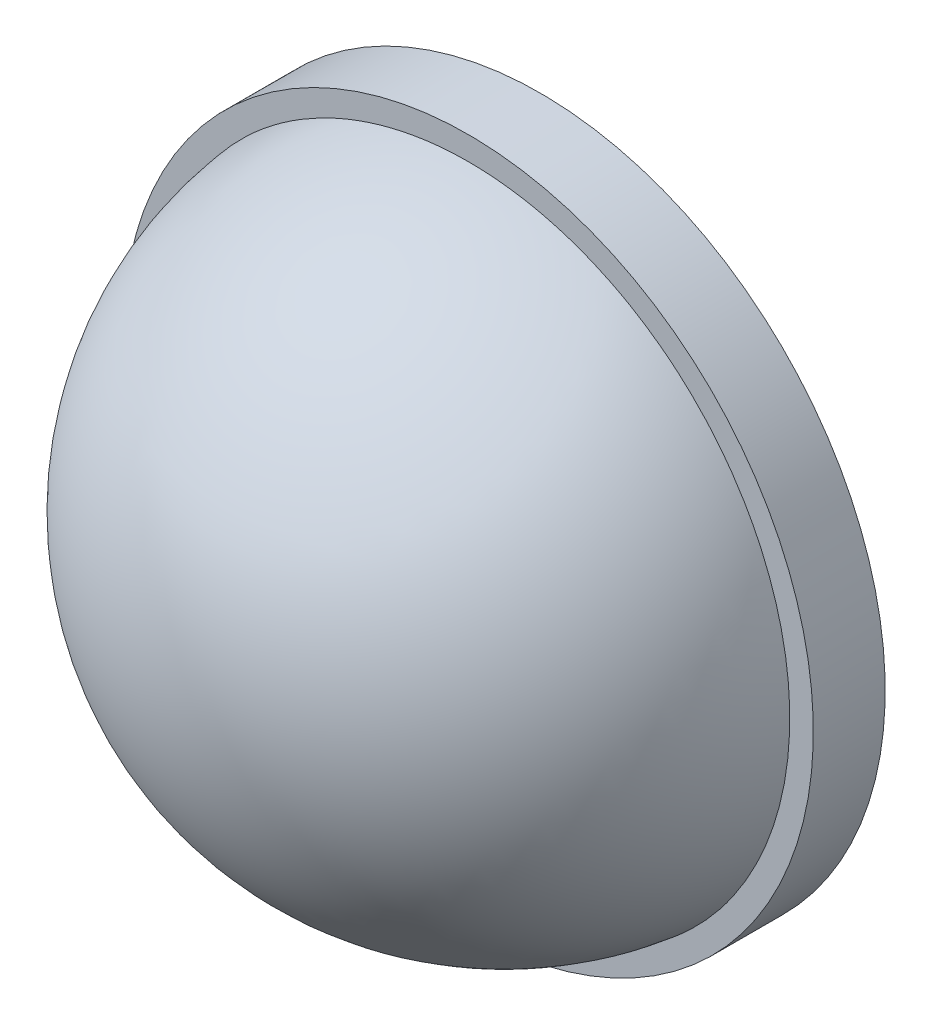
ISO-10303-21;
HEADER;
FILE_DESCRIPTION(('STEP AP214'),'2;1');
FILE_NAME('part.step','',(''),(''),'','','');
FILE_SCHEMA(('AUTOMOTIVE_DESIGN { 1 0 10303 214 1 1 1 1 }'));
ENDSEC;
DATA;
#1=APPLICATION_CONTEXT('core data for automotive mechanical design processes');
#2=APPLICATION_PROTOCOL_DEFINITION('international standard','automotive_design',2000,#1);
#3=PRODUCT_CONTEXT('',#1,'mechanical');
#4=PRODUCT('Part','Part','',(#3));
#5=PRODUCT_RELATED_PRODUCT_CATEGORY('part','',(#4));
#6=PRODUCT_DEFINITION_FORMATION('','',#4);
#7=PRODUCT_DEFINITION_CONTEXT('part definition',#1,'design');
#8=PRODUCT_DEFINITION('design','',#6,#7);
#9=PRODUCT_DEFINITION_SHAPE('','',#8);
#10=(LENGTH_UNIT() NAMED_UNIT(*) SI_UNIT(.MILLI.,.METRE.));
#11=(NAMED_UNIT(*) PLANE_ANGLE_UNIT() SI_UNIT($,.RADIAN.));
#12=(NAMED_UNIT(*) SI_UNIT($,.STERADIAN.) SOLID_ANGLE_UNIT());
#13=UNCERTAINTY_MEASURE_WITH_UNIT(LENGTH_MEASURE(1.E-05),#10,'distance_accuracy_value','');
#14=(GEOMETRIC_REPRESENTATION_CONTEXT(3) GLOBAL_UNCERTAINTY_ASSIGNED_CONTEXT((#13)) GLOBAL_UNIT_ASSIGNED_CONTEXT((#10,
#11,#12)) REPRESENTATION_CONTEXT('',''));
#15=CARTESIAN_POINT('',(0.,0.,0.));
#16=DIRECTION('',(0.,0.,1.));
#17=DIRECTION('',(1.,0.,0.));
#18=AXIS2_PLACEMENT_3D('',#15,#16,#17);
#19=CARTESIAN_POINT('',(0.,0.,0.));
#20=DIRECTION('',(0.,1.,0.));
#21=DIRECTION('',(0.,0.,1.));
#22=AXIS2_PLACEMENT_3D('',#19,#20,#21);
#23=SPHERICAL_SURFACE('',#22,4.5);
#24=CARTESIAN_POINT('',(0.,4.47213595499958,0.5));
#25=CARTESIAN_POINT('',(-0.150997514664612,4.47213887848108,0.5));
#26=CARTESIAN_POINT('',(-0.301969495913377,4.46448489805465,0.5));
#27=CARTESIAN_POINT('',(-0.602482273010113,4.43394007426907,0.5));
#28=CARTESIAN_POINT('',(-0.752022119762018,4.41103975193288,0.500000000000001));
#29=CARTESIAN_POINT('',(-1.02307863973414,4.3553539857282,0.500000000000001));
#30=CARTESIAN_POINT('',(-1.14507673289361,4.32488021057134,0.5));
#31=CARTESIAN_POINT('',(-1.3861170686883,4.25375942153719,0.5));
#32=CARTESIAN_POINT('',(-1.50515844505664,4.21310946397593,0.5));
#33=CARTESIAN_POINT('',(-1.73948709294649,4.12189355647516,0.5));
#34=CARTESIAN_POINT('',(-1.85477128486625,4.07131969942959,0.5));
#35=CARTESIAN_POINT('',(-2.08070940666502,3.96061604037249,0.5));
#36=CARTESIAN_POINT('',(-2.19136162660478,3.90048274802251,0.5));
#37=CARTESIAN_POINT('',(-2.40711503658964,3.77115412998921,0.5));
#38=CARTESIAN_POINT('',(-2.51222064528998,3.70196617534453,0.499999999999999));
#39=CARTESIAN_POINT('',(-2.71626783258023,3.55495522693636,0.500000000000002));
#40=CARTESIAN_POINT('',(-2.81520712411537,3.47712905871716,0.500000000000004));
#41=CARTESIAN_POINT('',(-3.00611704982059,3.31346626629332,0.499999999999997));
#42=CARTESIAN_POINT('',(-3.09809190872835,3.22763457005807,0.499999999999986));
#43=CARTESIAN_POINT('',(-3.27451904332029,3.0484971729806,0.500000000000015));
#44=CARTESIAN_POINT('',(-3.35896853015982,2.95518872544114,0.500000000000053));
#45=CARTESIAN_POINT('',(-3.51968465250268,2.76181489479289,0.500000000000053));
#46=CARTESIAN_POINT('',(-3.59595347767667,2.6617513315299,0.500000000000015));
#47=CARTESIAN_POINT('',(-3.73981886528146,2.45551787522962,0.499999999999986));
#48=CARTESIAN_POINT('',(-3.80741221507932,2.34934574107259,0.499999999999997));
#49=CARTESIAN_POINT('',(-3.93339224115332,2.13171957576029,0.500000000000004));
#50=CARTESIAN_POINT('',(-3.99178192636583,2.02026728639832,0.500000000000002));
#51=CARTESIAN_POINT('',(-4.09898616509148,1.79279863126297,0.499999999999999));
#52=CARTESIAN_POINT('',(-4.14779717531719,1.67678059553606,0.499999999999999));
#53=CARTESIAN_POINT('',(-4.23545292877497,1.44109010330004,0.5));
#54=CARTESIAN_POINT('',(-4.27430153379665,1.32141908301163,0.5));
#55=CARTESIAN_POINT('',(-4.34179371461896,1.0791855642772,0.500000000000001));
#56=CARTESIAN_POINT('',(-4.37043351750144,0.956622014629919,0.5));
#57=CARTESIAN_POINT('',(-4.41727535839403,0.709563064049555,0.5));
#58=CARTESIAN_POINT('',(-4.43548127777803,0.585068399209327,0.500000000000001));
#59=CARTESIAN_POINT('',(-4.4613483228333,0.33494413435646,0.5));
#60=CARTESIAN_POINT('',(-4.46900555289547,0.209314132296478,0.5));
#61=CARTESIAN_POINT('',(-4.47370330378257,-0.0421067366506297,0.5));
#62=CARTESIAN_POINT('',(-4.47074773301795,-0.167897527266527,0.5));
#63=CARTESIAN_POINT('',(-4.45426150332976,-0.418796730104737,0.500000000000001));
#64=CARTESIAN_POINT('',(-4.44072694046182,-0.543904873244764,0.500000000000001));
#65=CARTESIAN_POINT('',(-4.38435427865963,-0.916768604936241,0.5));
#66=CARTESIAN_POINT('',(-4.32575205895234,-1.16233640802484,0.5));
#67=CARTESIAN_POINT('',(-4.16817661474933,-1.64001540578852,0.5));
#68=CARTESIAN_POINT('',(-4.06920289654608,-1.87212643585958,0.5));
#69=CARTESIAN_POINT('',(-3.83368748984246,-2.31646802342858,0.500000000000001));
#70=CARTESIAN_POINT('',(-3.69714677734392,-2.52869909722178,0.5));
#71=CARTESIAN_POINT('',(-3.39038630415402,-2.92720365271011,0.500000000000001));
#72=CARTESIAN_POINT('',(-3.22016866561958,-3.11347876876418,0.500000000000001));
#73=CARTESIAN_POINT('',(-2.85084401981479,-3.45483950694928,0.5));
#74=CARTESIAN_POINT('',(-2.65173262592018,-3.60992038465297,0.499999999999999));
#75=CARTESIAN_POINT('',(-2.2302624176303,-3.88448582361263,0.499999999999999));
#76=CARTESIAN_POINT('',(-2.00789725690763,-4.00396063296944,0.5));
#77=CARTESIAN_POINT('',(-1.54634080827002,-4.20380349017741,0.500000000000001));
#78=CARTESIAN_POINT('',(-1.30716139095409,-4.2841988163888,0.5));
#79=CARTESIAN_POINT('',(-0.889195891287263,-4.38650885240195,0.5));
#80=CARTESIAN_POINT('',(-0.712821898474079,-4.4185924362847,0.5));
#81=CARTESIAN_POINT('',(-0.357618309435979,-4.46139393049345,0.500000000000001));
#82=CARTESIAN_POINT('',(-0.178791255590017,-4.47213249340004,0.500000000000001));
#83=CARTESIAN_POINT('',(0.150997514664612,-4.47213887848108,0.500000000000001));
#84=CARTESIAN_POINT('',(0.301969495913377,-4.46448489805465,0.500000000000001));
#85=CARTESIAN_POINT('',(0.602482273010113,-4.43394007426907,0.5));
#86=CARTESIAN_POINT('',(0.752022119762018,-4.41103975193288,0.5));
#87=CARTESIAN_POINT('',(1.02307863973414,-4.3553539857282,0.5));
#88=CARTESIAN_POINT('',(1.14507673289361,-4.32488021057134,0.5));
#89=CARTESIAN_POINT('',(1.3861170686883,-4.25375942153719,0.5));
#90=CARTESIAN_POINT('',(1.50515844505664,-4.21310946397593,0.5));
#91=CARTESIAN_POINT('',(1.73948709294649,-4.12189355647516,0.5));
#92=CARTESIAN_POINT('',(1.85477128486625,-4.07131969942959,0.5));
#93=CARTESIAN_POINT('',(2.08070940666502,-3.96061604037249,0.5));
#94=CARTESIAN_POINT('',(2.19136162660478,-3.90048274802251,0.5));
#95=CARTESIAN_POINT('',(2.40711503658964,-3.77115412998921,0.5));
#96=CARTESIAN_POINT('',(2.51222064528998,-3.70196617534454,0.499999999999999));
#97=CARTESIAN_POINT('',(2.71626783258022,-3.55495522693636,0.500000000000002));
#98=CARTESIAN_POINT('',(2.81520712411537,-3.47712905871716,0.500000000000004));
#99=CARTESIAN_POINT('',(3.00611704982059,-3.31346626629332,0.499999999999997));
#100=CARTESIAN_POINT('',(3.09809190872835,-3.22763457005807,0.499999999999987));
#101=CARTESIAN_POINT('',(3.27451904332028,-3.04849717298061,0.500000000000014));
#102=CARTESIAN_POINT('',(3.35896853015982,-2.95518872544115,0.500000000000052));
#103=CARTESIAN_POINT('',(3.51968465250268,-2.76181489479289,0.500000000000052));
#104=CARTESIAN_POINT('',(3.59595347767667,-2.6617513315299,0.500000000000014));
#105=CARTESIAN_POINT('',(3.73981886528145,-2.45551787522962,0.499999999999987));
#106=CARTESIAN_POINT('',(3.80741221507932,-2.3493457410726,0.499999999999997));
#107=CARTESIAN_POINT('',(3.93339224115332,-2.13171957576029,0.500000000000004));
#108=CARTESIAN_POINT('',(3.99178192636582,-2.02026728639832,0.500000000000001));
#109=CARTESIAN_POINT('',(4.09898616509147,-1.79279863126298,0.499999999999999));
#110=CARTESIAN_POINT('',(4.14779717531719,-1.67678059553606,0.5));
#111=CARTESIAN_POINT('',(4.23545292877497,-1.44109010330004,0.500000000000001));
#112=CARTESIAN_POINT('',(4.27430153379665,-1.32141908301163,0.500000000000001));
#113=CARTESIAN_POINT('',(4.34179371461896,-1.0791855642772,0.5));
#114=CARTESIAN_POINT('',(4.37043351750144,-0.956622014629922,0.5));
#115=CARTESIAN_POINT('',(4.41727535839403,-0.709563064049558,0.500000000000001));
#116=CARTESIAN_POINT('',(4.43548127777803,-0.58506839920933,0.500000000000001));
#117=CARTESIAN_POINT('',(4.4613483228333,-0.334944134356463,0.5));
#118=CARTESIAN_POINT('',(4.46900555289547,-0.209314132296482,0.5));
#119=CARTESIAN_POINT('',(4.47370330378257,0.0421067366506264,0.5));
#120=CARTESIAN_POINT('',(4.47074773301795,0.167897527266524,0.5));
#121=CARTESIAN_POINT('',(4.45426150332976,0.418796730104734,0.500000000000001));
#122=CARTESIAN_POINT('',(4.44072694046182,0.543904873244761,0.500000000000001));
#123=CARTESIAN_POINT('',(4.38435427865963,0.916768604936239,0.5));
#124=CARTESIAN_POINT('',(4.32575205895234,1.16233640802484,0.5));
#125=CARTESIAN_POINT('',(4.16817661474933,1.64001540578852,0.5));
#126=CARTESIAN_POINT('',(4.06920289654609,1.87212643585958,0.5));
#127=CARTESIAN_POINT('',(3.83368748984246,2.31646802342857,0.5));
#128=CARTESIAN_POINT('',(3.69714677734392,2.52869909722178,0.5));
#129=CARTESIAN_POINT('',(3.39038630415402,2.92720365271011,0.5));
#130=CARTESIAN_POINT('',(3.22016866561958,3.11347876876418,0.500000000000001));
#131=CARTESIAN_POINT('',(2.85084401981479,3.45483950694928,0.5));
#132=CARTESIAN_POINT('',(2.65173262592018,3.60992038465297,0.499999999999999));
#133=CARTESIAN_POINT('',(2.2302624176303,3.88448582361263,0.499999999999999));
#134=CARTESIAN_POINT('',(2.00789725690763,4.00396063296944,0.5));
#135=CARTESIAN_POINT('',(1.54634080827002,4.20380349017741,0.500000000000001));
#136=CARTESIAN_POINT('',(1.30716139095409,4.2841988163888,0.500000000000001));
#137=CARTESIAN_POINT('',(0.889195891287265,4.38650885240195,0.5));
#138=CARTESIAN_POINT('',(0.71282189847408,4.4185924362847,0.5));
#139=CARTESIAN_POINT('',(0.35761830943598,4.46139393049345,0.5));
#140=CARTESIAN_POINT('',(0.178791255590018,4.47213249340004,0.5));
#141=CARTESIAN_POINT('',(0.,4.47213595499958,0.5));
#142=B_SPLINE_CURVE_WITH_KNOTS('',3,(#24,#25,#26,#27,#28,#29,#30,#31,#32,#33,#34,#35,#36,#37,
#38,#39,#40,#41,#42,#43,#44,#45,#46,#47,#48,#49,#50,#51,#52,#53,#54,#55,#56,#57,#58,#59,#60,#61,
#62,#63,#64,#65,#66,#67,#68,#69,#70,#71,#72,#73,#74,#75,#76,#77,#78,#79,#80,#81,#82,#83,#84,#85,
#86,#87,#88,#89,#90,#91,#92,#93,#94,#95,#96,#97,#98,#99,#100,#101,#102,#103,#104,#105,#106,#107,
#108,#109,#110,#111,#112,#113,#114,#115,#116,#117,#118,#119,#120,#121,#122,#123,#124,#125,#126,
#127,#128,#129,#130,#131,#132,#133,#134,#135,#136,#137,#138,#139,#140,#141),.UNSPECIFIED.,.T.,
.F.,(4,2,2,2,2,2,2,2,2,2,2,2,2,2,2,2,2,2,2,2,2,2,2,2,2,2,2,2,2,2,2,2,2,2,2,2,2,2,2,2,2,2,2,2,2,
2,2,2,2,2,2,2,2,2,2,2,2,2,4),(0.,0.452759592057519,0.905800937637214,1.28261206959558,
1.65953232864876,2.03675413646417,2.41411399308629,2.79116854508421,3.1683621224618,
3.54532502391733,3.92242704892076,4.29942788397771,4.67656792663595,5.05358441474362,
5.43074010477785,5.80774937383516,6.18489783198708,6.56190590080623,6.93905316063406,
7.31606154146879,7.693209114678,8.44669571679006,9.20019153364948,9.95366777630856,
10.7070965536552,11.4606398357926,12.2143893114069,12.9676118946624,13.5042292931668,
14.0403272291109,14.4930868211684,14.9461281667481,15.3229392987065,15.6998595577597,
16.0770813655751,16.4544412221972,16.8314957741951,17.2086893515727,17.5856522530283,
17.9627542780317,18.3397551130886,18.7168951557469,19.0939116438545,19.4710673338888,
19.8480766029461,20.225225061098,20.6022331299171,20.979380389745,21.3563887705797,
21.7335363437889,22.487022945901,23.2405187627604,23.9939950054195,24.7474237827661,
25.5009670649035,26.2547165405178,27.0079391237733,27.5445565222777,28.0806544582218),.UNSPECIFIED.);
#143=CARTESIAN_POINT('',(0.,4.47213595499958,0.5));
#144=VERTEX_POINT('',#143);
#145=EDGE_CURVE('E20',#144,#144,#142,.T.);
#146=ORIENTED_EDGE('',*,*,#145,.T.);
#147=EDGE_LOOP('',(#146));
#148=FACE_BOUND('',#147,.T.);
#149=ADVANCED_FACE('F15',(#148),#23,.T.);
#150=CARTESIAN_POINT('',(0.,4.47213595499958,0.5));
#151=DIRECTION('',(0.,0.,-1.));
#152=DIRECTION('',(-1.,0.,0.));
#153=AXIS2_PLACEMENT_3D('',#150,#151,#152);
#154=PLANE('',#153);
#155=ORIENTED_EDGE('',*,*,#145,.F.);
#156=EDGE_LOOP('',(#155));
#157=FACE_BOUND('',#156,.T.);
#158=CARTESIAN_POINT('',(0.,0.,0.5));
#159=DIRECTION('',(0.,0.,-1.));
#160=DIRECTION('',(-1.,0.,0.));
#161=AXIS2_PLACEMENT_3D('',#158,#159,#160);
#162=CIRCLE('',#161,4.8);
#163=CARTESIAN_POINT('',(-4.8,0.,0.5));
#164=VERTEX_POINT('',#163);
#165=EDGE_CURVE('E26',#164,#164,#162,.T.);
#166=ORIENTED_EDGE('',*,*,#165,.F.);
#167=EDGE_LOOP('',(#166));
#168=FACE_BOUND('',#167,.T.);
#169=ADVANCED_FACE('F38',(#157,#168),#154,.F.);
#170=CARTESIAN_POINT('',(0.,0.,-0.5));
#171=DIRECTION('',(0.,0.,-1.));
#172=DIRECTION('',(-1.,0.,0.));
#173=AXIS2_PLACEMENT_3D('',#170,#171,#172);
#174=CYLINDRICAL_SURFACE('',#173,4.8);
#175=ORIENTED_EDGE('',*,*,#165,.T.);
#176=EDGE_LOOP('',(#175));
#177=FACE_BOUND('',#176,.T.);
#178=CARTESIAN_POINT('',(0.,0.,-0.5));
#179=DIRECTION('',(0.,0.,-1.));
#180=DIRECTION('',(-1.,0.,0.));
#181=AXIS2_PLACEMENT_3D('',#178,#179,#180);
#182=CIRCLE('',#181,4.8);
#183=CARTESIAN_POINT('',(-4.8,0.,-0.5));
#184=VERTEX_POINT('',#183);
#185=EDGE_CURVE('E10',#184,#184,#182,.F.);
#186=ORIENTED_EDGE('',*,*,#185,.T.);
#187=EDGE_LOOP('',(#186));
#188=FACE_BOUND('',#187,.T.);
#189=ADVANCED_FACE('F41',(#177,#188),#174,.T.);
#190=CARTESIAN_POINT('',(0.,0.,-0.5));
#191=DIRECTION('',(0.,0.,1.));
#192=DIRECTION('',(1.,0.,0.));
#193=AXIS2_PLACEMENT_3D('',#190,#191,#192);
#194=PLANE('',#193);
#195=ORIENTED_EDGE('',*,*,#185,.F.);
#196=EDGE_LOOP('',(#195));
#197=FACE_BOUND('',#196,.T.);
#198=ADVANCED_FACE('F47',(#197),#194,.F.);
#199=CLOSED_SHELL('',(#149,#169,#189,#198));
#200=MANIFOLD_SOLID_BREP('B1',#199);
#201=ADVANCED_BREP_SHAPE_REPRESENTATION('',(#18,#200),#14);
#202=SHAPE_DEFINITION_REPRESENTATION(#9,#201);
ENDSEC;
END-ISO-10303-21;
